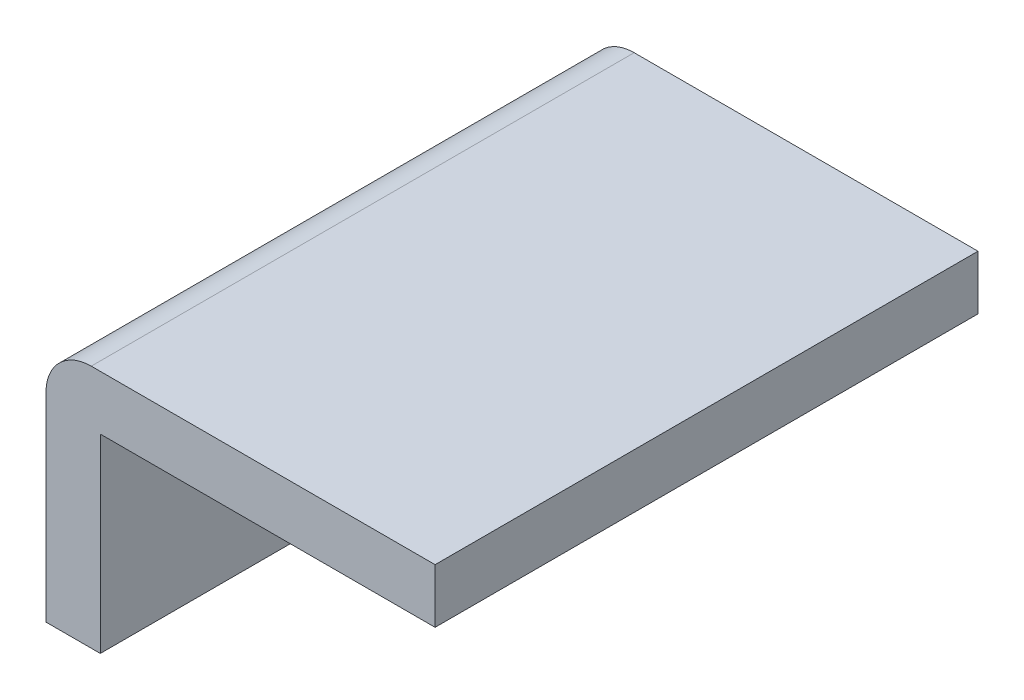
ISO-10303-21;
HEADER;
FILE_DESCRIPTION(('STEP AP214'),'2;1');
FILE_NAME('part.step','',(''),(''),'','','');
FILE_SCHEMA(('AUTOMOTIVE_DESIGN { 1 0 10303 214 1 1 1 1 }'));
ENDSEC;
DATA;
#1=APPLICATION_CONTEXT('core data for automotive mechanical design processes');
#2=APPLICATION_PROTOCOL_DEFINITION('international standard','automotive_design',2000,#1);
#3=PRODUCT_CONTEXT('',#1,'mechanical');
#4=PRODUCT('Part','Part','',(#3));
#5=PRODUCT_RELATED_PRODUCT_CATEGORY('part','',(#4));
#6=PRODUCT_DEFINITION_FORMATION('','',#4);
#7=PRODUCT_DEFINITION_CONTEXT('part definition',#1,'design');
#8=PRODUCT_DEFINITION('design','',#6,#7);
#9=PRODUCT_DEFINITION_SHAPE('','',#8);
#10=(LENGTH_UNIT() NAMED_UNIT(*) SI_UNIT(.MILLI.,.METRE.));
#11=(NAMED_UNIT(*) PLANE_ANGLE_UNIT() SI_UNIT($,.RADIAN.));
#12=(NAMED_UNIT(*) SI_UNIT($,.STERADIAN.) SOLID_ANGLE_UNIT());
#13=UNCERTAINTY_MEASURE_WITH_UNIT(LENGTH_MEASURE(1.E-05),#10,'distance_accuracy_value','');
#14=(GEOMETRIC_REPRESENTATION_CONTEXT(3) GLOBAL_UNCERTAINTY_ASSIGNED_CONTEXT((#13)) GLOBAL_UNIT_ASSIGNED_CONTEXT((#10,
#11,#12)) REPRESENTATION_CONTEXT('',''));
#15=CARTESIAN_POINT('',(0.,0.,0.));
#16=DIRECTION('',(0.,0.,1.));
#17=DIRECTION('',(1.,0.,0.));
#18=AXIS2_PLACEMENT_3D('',#15,#16,#17);
#19=CARTESIAN_POINT('',(-1.5,0.,30.));
#20=DIRECTION('',(-1.,0.,0.));
#21=DIRECTION('',(0.,0.,1.));
#22=AXIS2_PLACEMENT_3D('',#19,#20,#21);
#23=PLANE('',#22);
#24=DIRECTION('',(0.,1.,0.));
#25=VECTOR('',#24,1.);
#26=CARTESIAN_POINT('',(-1.5,0.,0.));
#27=LINE('',#26,#25);
#28=CARTESIAN_POINT('',(-1.5,0.,0.));
#29=VERTEX_POINT('',#28);
#30=CARTESIAN_POINT('',(-1.5,11.,0.));
#31=VERTEX_POINT('',#30);
#32=EDGE_CURVE('E123',#29,#31,#27,.T.);
#33=ORIENTED_EDGE('',*,*,#32,.F.);
#34=DIRECTION('',(0.,0.,-1.));
#35=VECTOR('',#34,1.);
#36=CARTESIAN_POINT('',(-1.5,0.,30.));
#37=LINE('',#36,#35);
#38=CARTESIAN_POINT('',(-1.5,0.,30.));
#39=VERTEX_POINT('',#38);
#40=EDGE_CURVE('E11',#39,#29,#37,.T.);
#41=ORIENTED_EDGE('',*,*,#40,.F.);
#42=DIRECTION('',(0.,1.,0.));
#43=VECTOR('',#42,1.);
#44=CARTESIAN_POINT('',(-1.5,0.,30.));
#45=LINE('',#44,#43);
#46=CARTESIAN_POINT('',(-1.5,11.,30.));
#47=VERTEX_POINT('',#46);
#48=EDGE_CURVE('E138',#39,#47,#45,.T.);
#49=ORIENTED_EDGE('',*,*,#48,.T.);
#50=DIRECTION('',(0.,0.,-1.));
#51=VECTOR('',#50,1.);
#52=CARTESIAN_POINT('',(-1.5,11.,30.));
#53=LINE('',#52,#51);
#54=EDGE_CURVE('E52',#47,#31,#53,.T.);
#55=ORIENTED_EDGE('',*,*,#54,.T.);
#56=EDGE_LOOP('',(#33,#41,#49,#55));
#57=FACE_BOUND('',#56,.T.);
#58=ADVANCED_FACE('F36',(#57),#23,.T.);
#59=CARTESIAN_POINT('',(0.,0.,30.));
#60=DIRECTION('',(0.,1.,0.));
#61=DIRECTION('',(0.,0.,1.));
#62=AXIS2_PLACEMENT_3D('',#59,#60,#61);
#63=PLANE('',#62);
#64=DIRECTION('',(1.,0.,0.));
#65=VECTOR('',#64,1.);
#66=CARTESIAN_POINT('',(0.,0.,0.));
#67=LINE('',#66,#65);
#68=CARTESIAN_POINT('',(1.5,0.,0.));
#69=VERTEX_POINT('',#68);
#70=EDGE_CURVE('E125',#29,#69,#67,.T.);
#71=ORIENTED_EDGE('',*,*,#70,.T.);
#72=DIRECTION('',(0.,0.,-1.));
#73=VECTOR('',#72,1.);
#74=CARTESIAN_POINT('',(1.5,0.,30.));
#75=LINE('',#74,#73);
#76=CARTESIAN_POINT('',(1.5,0.,30.));
#77=VERTEX_POINT('',#76);
#78=EDGE_CURVE('E44',#77,#69,#75,.T.);
#79=ORIENTED_EDGE('',*,*,#78,.F.);
#80=DIRECTION('',(1.,0.,0.));
#81=VECTOR('',#80,1.);
#82=CARTESIAN_POINT('',(0.,0.,30.));
#83=LINE('',#82,#81);
#84=EDGE_CURVE('E159',#39,#77,#83,.T.);
#85=ORIENTED_EDGE('',*,*,#84,.F.);
#86=ORIENTED_EDGE('',*,*,#40,.T.);
#87=EDGE_LOOP('',(#71,#79,#85,#86));
#88=FACE_BOUND('',#87,.T.);
#89=ADVANCED_FACE('F174',(#88),#63,.F.);
#90=CARTESIAN_POINT('',(1.5,0.,30.));
#91=DIRECTION('',(-1.,0.,0.));
#92=DIRECTION('',(0.,0.,1.));
#93=AXIS2_PLACEMENT_3D('',#90,#91,#92);
#94=PLANE('',#93);
#95=DIRECTION('',(0.,1.,0.));
#96=VECTOR('',#95,1.);
#97=CARTESIAN_POINT('',(1.5,0.,0.));
#98=LINE('',#97,#96);
#99=CARTESIAN_POINT('',(1.5,10.5,0.));
#100=VERTEX_POINT('',#99);
#101=EDGE_CURVE('E127',#69,#100,#98,.T.);
#102=ORIENTED_EDGE('',*,*,#101,.T.);
#103=DIRECTION('',(0.,0.,-1.));
#104=VECTOR('',#103,1.);
#105=CARTESIAN_POINT('',(1.5,10.5,30.));
#106=LINE('',#105,#104);
#107=CARTESIAN_POINT('',(1.5,10.5,30.));
#108=VERTEX_POINT('',#107);
#109=EDGE_CURVE('E142',#108,#100,#106,.T.);
#110=ORIENTED_EDGE('',*,*,#109,.F.);
#111=DIRECTION('',(0.,1.,0.));
#112=VECTOR('',#111,1.);
#113=CARTESIAN_POINT('',(1.5,0.,30.));
#114=LINE('',#113,#112);
#115=EDGE_CURVE('E151',#77,#108,#114,.T.);
#116=ORIENTED_EDGE('',*,*,#115,.F.);
#117=ORIENTED_EDGE('',*,*,#78,.T.);
#118=EDGE_LOOP('',(#102,#110,#116,#117));
#119=FACE_BOUND('',#118,.T.);
#120=ADVANCED_FACE('F149',(#119),#94,.F.);
#121=CARTESIAN_POINT('',(0.,10.5,30.));
#122=DIRECTION('',(0.,1.,0.));
#123=DIRECTION('',(0.,0.,1.));
#124=AXIS2_PLACEMENT_3D('',#121,#122,#123);
#125=PLANE('',#124);
#126=DIRECTION('',(1.,0.,0.));
#127=VECTOR('',#126,1.);
#128=CARTESIAN_POINT('',(0.,10.5,0.));
#129=LINE('',#128,#127);
#130=CARTESIAN_POINT('',(20.,10.5,0.));
#131=VERTEX_POINT('',#130);
#132=EDGE_CURVE('E129',#100,#131,#129,.T.);
#133=ORIENTED_EDGE('',*,*,#132,.T.);
#134=DIRECTION('',(0.,0.,-1.));
#135=VECTOR('',#134,1.);
#136=CARTESIAN_POINT('',(20.,10.5,30.));
#137=LINE('',#136,#135);
#138=CARTESIAN_POINT('',(20.,10.5,30.));
#139=VERTEX_POINT('',#138);
#140=EDGE_CURVE('E105',#139,#131,#137,.T.);
#141=ORIENTED_EDGE('',*,*,#140,.F.);
#142=DIRECTION('',(1.,0.,0.));
#143=VECTOR('',#142,1.);
#144=CARTESIAN_POINT('',(0.,10.5,30.));
#145=LINE('',#144,#143);
#146=EDGE_CURVE('E114',#108,#139,#145,.T.);
#147=ORIENTED_EDGE('',*,*,#146,.F.);
#148=ORIENTED_EDGE('',*,*,#109,.T.);
#149=EDGE_LOOP('',(#133,#141,#147,#148));
#150=FACE_BOUND('',#149,.T.);
#151=ADVANCED_FACE('F158',(#150),#125,.F.);
#152=CARTESIAN_POINT('',(20.,0.,30.));
#153=DIRECTION('',(1.,0.,0.));
#154=DIRECTION('',(0.,0.,-1.));
#155=AXIS2_PLACEMENT_3D('',#152,#153,#154);
#156=PLANE('',#155);
#157=DIRECTION('',(0.,-1.,0.));
#158=VECTOR('',#157,1.);
#159=CARTESIAN_POINT('',(20.,0.,0.));
#160=LINE('',#159,#158);
#161=CARTESIAN_POINT('',(20.,13.5,0.));
#162=VERTEX_POINT('',#161);
#163=EDGE_CURVE('E101',#162,#131,#160,.T.);
#164=ORIENTED_EDGE('',*,*,#163,.F.);
#165=DIRECTION('',(0.,0.,-1.));
#166=VECTOR('',#165,1.);
#167=CARTESIAN_POINT('',(20.,13.5,30.));
#168=LINE('',#167,#166);
#169=CARTESIAN_POINT('',(20.,13.5,30.));
#170=VERTEX_POINT('',#169);
#171=EDGE_CURVE('E96',#170,#162,#168,.T.);
#172=ORIENTED_EDGE('',*,*,#171,.F.);
#173=DIRECTION('',(0.,-1.,0.));
#174=VECTOR('',#173,1.);
#175=CARTESIAN_POINT('',(20.,0.,30.));
#176=LINE('',#175,#174);
#177=EDGE_CURVE('E99',#170,#139,#176,.T.);
#178=ORIENTED_EDGE('',*,*,#177,.T.);
#179=ORIENTED_EDGE('',*,*,#140,.T.);
#180=EDGE_LOOP('',(#164,#172,#178,#179));
#181=FACE_BOUND('',#180,.T.);
#182=ADVANCED_FACE('F98',(#181),#156,.T.);
#183=CARTESIAN_POINT('',(0.,13.5,30.));
#184=DIRECTION('',(0.,1.,0.));
#185=DIRECTION('',(0.,0.,1.));
#186=AXIS2_PLACEMENT_3D('',#183,#184,#185);
#187=PLANE('',#186);
#188=DIRECTION('',(1.,0.,0.));
#189=VECTOR('',#188,1.);
#190=CARTESIAN_POINT('',(0.,13.5,0.));
#191=LINE('',#190,#189);
#192=CARTESIAN_POINT('',(1.,13.5,0.));
#193=VERTEX_POINT('',#192);
#194=EDGE_CURVE('E133',#193,#162,#191,.T.);
#195=ORIENTED_EDGE('',*,*,#194,.F.);
#196=DIRECTION('',(0.,0.,-1.));
#197=VECTOR('',#196,1.);
#198=CARTESIAN_POINT('',(1.,13.5,30.));
#199=LINE('',#198,#197);
#200=CARTESIAN_POINT('',(1.,13.5,30.));
#201=VERTEX_POINT('',#200);
#202=EDGE_CURVE('E74',#201,#193,#199,.T.);
#203=ORIENTED_EDGE('',*,*,#202,.F.);
#204=DIRECTION('',(1.,0.,0.));
#205=VECTOR('',#204,1.);
#206=CARTESIAN_POINT('',(0.,13.5,30.));
#207=LINE('',#206,#205);
#208=EDGE_CURVE('E112',#201,#170,#207,.T.);
#209=ORIENTED_EDGE('',*,*,#208,.T.);
#210=ORIENTED_EDGE('',*,*,#171,.T.);
#211=EDGE_LOOP('',(#195,#203,#209,#210));
#212=FACE_BOUND('',#211,.T.);
#213=ADVANCED_FACE('F117',(#212),#187,.T.);
#214=CARTESIAN_POINT('',(1.,11.,30.));
#215=DIRECTION('',(0.,0.,-1.));
#216=DIRECTION('',(-1.,0.,0.));
#217=AXIS2_PLACEMENT_3D('',#214,#215,#216);
#218=CYLINDRICAL_SURFACE('',#217,2.5);
#219=CARTESIAN_POINT('',(1.,11.,0.));
#220=DIRECTION('',(0.,0.,1.));
#221=DIRECTION('',(1.,0.,0.));
#222=AXIS2_PLACEMENT_3D('',#219,#220,#221);
#223=CIRCLE('',#222,2.5);
#224=EDGE_CURVE('E135',#31,#193,#223,.F.);
#225=ORIENTED_EDGE('',*,*,#224,.F.);
#226=ORIENTED_EDGE('',*,*,#54,.F.);
#227=CARTESIAN_POINT('',(1.,11.,30.));
#228=DIRECTION('',(0.,0.,1.));
#229=DIRECTION('',(1.,0.,0.));
#230=AXIS2_PLACEMENT_3D('',#227,#228,#229);
#231=CIRCLE('',#230,2.5);
#232=EDGE_CURVE('E118',#47,#201,#231,.F.);
#233=ORIENTED_EDGE('',*,*,#232,.T.);
#234=ORIENTED_EDGE('',*,*,#202,.T.);
#235=EDGE_LOOP('',(#225,#226,#233,#234));
#236=FACE_BOUND('',#235,.T.);
#237=ADVANCED_FACE('F163',(#236),#218,.T.);
#238=CARTESIAN_POINT('',(0.,0.,30.));
#239=DIRECTION('',(0.,0.,1.));
#240=DIRECTION('',(1.,0.,0.));
#241=AXIS2_PLACEMENT_3D('',#238,#239,#240);
#242=PLANE('',#241);
#243=ORIENTED_EDGE('',*,*,#48,.F.);
#244=ORIENTED_EDGE('',*,*,#84,.T.);
#245=ORIENTED_EDGE('',*,*,#115,.T.);
#246=ORIENTED_EDGE('',*,*,#146,.T.);
#247=ORIENTED_EDGE('',*,*,#177,.F.);
#248=ORIENTED_EDGE('',*,*,#208,.F.);
#249=ORIENTED_EDGE('',*,*,#232,.F.);
#250=EDGE_LOOP('',(#243,#244,#245,#246,#247,#248,#249));
#251=FACE_BOUND('',#250,.T.);
#252=ADVANCED_FACE('F110',(#251),#242,.T.);
#253=CARTESIAN_POINT('',(0.,0.,0.));
#254=DIRECTION('',(0.,0.,1.));
#255=DIRECTION('',(1.,0.,0.));
#256=AXIS2_PLACEMENT_3D('',#253,#254,#255);
#257=PLANE('',#256);
#258=ORIENTED_EDGE('',*,*,#32,.T.);
#259=ORIENTED_EDGE('',*,*,#224,.T.);
#260=ORIENTED_EDGE('',*,*,#194,.T.);
#261=ORIENTED_EDGE('',*,*,#163,.T.);
#262=ORIENTED_EDGE('',*,*,#132,.F.);
#263=ORIENTED_EDGE('',*,*,#101,.F.);
#264=ORIENTED_EDGE('',*,*,#70,.F.);
#265=EDGE_LOOP('',(#258,#259,#260,#261,#262,#263,#264));
#266=FACE_BOUND('',#265,.T.);
#267=ADVANCED_FACE('F156',(#266),#257,.F.);
#268=CLOSED_SHELL('',(#58,#89,#120,#151,#182,#213,#237,#252,#267));
#269=MANIFOLD_SOLID_BREP('B2',#268);
#270=ADVANCED_BREP_SHAPE_REPRESENTATION('',(#18,#269),#14);
#271=SHAPE_DEFINITION_REPRESENTATION(#9,#270);
ENDSEC;
END-ISO-10303-21;
